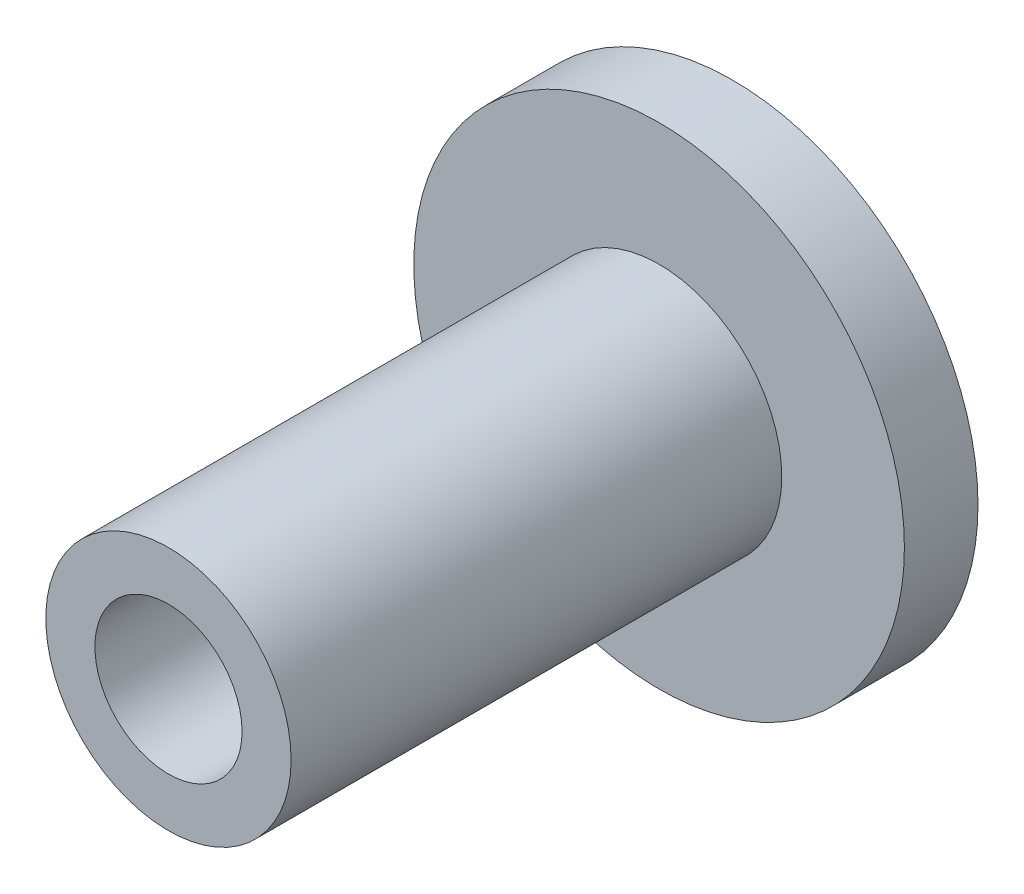
ISO-10303-21;
HEADER;
FILE_DESCRIPTION(('STEP AP214'),'2;1');
FILE_NAME('part.step','',(''),(''),'','','');
FILE_SCHEMA(('AUTOMOTIVE_DESIGN { 1 0 10303 214 1 1 1 1 }'));
ENDSEC;
DATA;
#1=APPLICATION_CONTEXT('core data for automotive mechanical design processes');
#2=APPLICATION_PROTOCOL_DEFINITION('international standard','automotive_design',2000,#1);
#3=PRODUCT_CONTEXT('',#1,'mechanical');
#4=PRODUCT('Part','Part','',(#3));
#5=PRODUCT_RELATED_PRODUCT_CATEGORY('part','',(#4));
#6=PRODUCT_DEFINITION_FORMATION('','',#4);
#7=PRODUCT_DEFINITION_CONTEXT('part definition',#1,'design');
#8=PRODUCT_DEFINITION('design','',#6,#7);
#9=PRODUCT_DEFINITION_SHAPE('','',#8);
#10=(LENGTH_UNIT() NAMED_UNIT(*) SI_UNIT(.MILLI.,.METRE.));
#11=(NAMED_UNIT(*) PLANE_ANGLE_UNIT() SI_UNIT($,.RADIAN.));
#12=(NAMED_UNIT(*) SI_UNIT($,.STERADIAN.) SOLID_ANGLE_UNIT());
#13=UNCERTAINTY_MEASURE_WITH_UNIT(LENGTH_MEASURE(1.E-05),#10,'distance_accuracy_value','');
#14=(GEOMETRIC_REPRESENTATION_CONTEXT(3) GLOBAL_UNCERTAINTY_ASSIGNED_CONTEXT((#13)) GLOBAL_UNIT_ASSIGNED_CONTEXT((#10,
#11,#12)) REPRESENTATION_CONTEXT('',''));
#15=CARTESIAN_POINT('',(0.,0.,0.));
#16=DIRECTION('',(0.,0.,1.));
#17=DIRECTION('',(1.,0.,0.));
#18=AXIS2_PLACEMENT_3D('',#15,#16,#17);
#19=CARTESIAN_POINT('',(0.,0.,3.));
#20=DIRECTION('',(0.,0.,-1.));
#21=DIRECTION('',(-1.,0.,0.));
#22=AXIS2_PLACEMENT_3D('',#19,#20,#21);
#23=CYLINDRICAL_SURFACE('',#22,10.);
#24=CARTESIAN_POINT('',(0.,0.,3.));
#25=DIRECTION('',(0.,0.,1.));
#26=DIRECTION('',(1.,0.,0.));
#27=AXIS2_PLACEMENT_3D('',#24,#25,#26);
#28=CIRCLE('',#27,10.);
#29=CARTESIAN_POINT('',(10.,0.,3.));
#30=VERTEX_POINT('',#29);
#31=EDGE_CURVE('E45',#30,#30,#28,.T.);
#32=ORIENTED_EDGE('',*,*,#31,.F.);
#33=EDGE_LOOP('',(#32));
#34=FACE_BOUND('',#33,.T.);
#35=CARTESIAN_POINT('',(0.,0.,0.));
#36=DIRECTION('',(0.,0.,1.));
#37=DIRECTION('',(1.,0.,0.));
#38=AXIS2_PLACEMENT_3D('',#35,#36,#37);
#39=CIRCLE('',#38,10.);
#40=CARTESIAN_POINT('',(10.,0.,0.));
#41=VERTEX_POINT('',#40);
#42=EDGE_CURVE('E40',#41,#41,#39,.T.);
#43=ORIENTED_EDGE('',*,*,#42,.T.);
#44=EDGE_LOOP('',(#43));
#45=FACE_BOUND('',#44,.T.);
#46=ADVANCED_FACE('F37',(#34,#45),#23,.T.);
#47=CARTESIAN_POINT('',(0.,0.,3.));
#48=DIRECTION('',(0.,0.,1.));
#49=DIRECTION('',(1.,0.,0.));
#50=AXIS2_PLACEMENT_3D('',#47,#48,#49);
#51=PLANE('',#50);
#52=CARTESIAN_POINT('',(0.,0.,3.));
#53=DIRECTION('',(0.,0.,1.));
#54=DIRECTION('',(1.,0.,0.));
#55=AXIS2_PLACEMENT_3D('',#52,#53,#54);
#56=CIRCLE('',#55,5.);
#57=CARTESIAN_POINT('',(5.,0.,3.));
#58=VERTEX_POINT('',#57);
#59=EDGE_CURVE('E10',#58,#58,#56,.T.);
#60=ORIENTED_EDGE('',*,*,#59,.F.);
#61=EDGE_LOOP('',(#60));
#62=FACE_BOUND('',#61,.T.);
#63=ORIENTED_EDGE('',*,*,#31,.T.);
#64=EDGE_LOOP('',(#63));
#65=FACE_BOUND('',#64,.T.);
#66=ADVANCED_FACE('F86',(#62,#65),#51,.T.);
#67=CARTESIAN_POINT('',(0.,0.,0.));
#68=DIRECTION('',(0.,0.,1.));
#69=DIRECTION('',(1.,0.,0.));
#70=AXIS2_PLACEMENT_3D('',#67,#68,#69);
#71=PLANE('',#70);
#72=CARTESIAN_POINT('',(0.,0.,0.));
#73=DIRECTION('',(0.,0.,1.));
#74=DIRECTION('',(1.,0.,0.));
#75=AXIS2_PLACEMENT_3D('',#72,#73,#74);
#76=CIRCLE('',#75,3.);
#77=CARTESIAN_POINT('',(3.,0.,0.));
#78=VERTEX_POINT('',#77);
#79=EDGE_CURVE('E56',#78,#78,#76,.T.);
#80=ORIENTED_EDGE('',*,*,#79,.T.);
#81=EDGE_LOOP('',(#80));
#82=FACE_BOUND('',#81,.T.);
#83=ORIENTED_EDGE('',*,*,#42,.F.);
#84=EDGE_LOOP('',(#83));
#85=FACE_BOUND('',#84,.T.);
#86=ADVANCED_FACE('F65',(#82,#85),#71,.F.);
#87=CARTESIAN_POINT('',(0.,0.,23.));
#88=DIRECTION('',(0.,0.,-1.));
#89=DIRECTION('',(-1.,0.,0.));
#90=AXIS2_PLACEMENT_3D('',#87,#88,#89);
#91=CYLINDRICAL_SURFACE('',#90,5.);
#92=CARTESIAN_POINT('',(0.,0.,23.));
#93=DIRECTION('',(0.,0.,1.));
#94=DIRECTION('',(1.,0.,0.));
#95=AXIS2_PLACEMENT_3D('',#92,#93,#94);
#96=CIRCLE('',#95,5.);
#97=CARTESIAN_POINT('',(5.,0.,23.));
#98=VERTEX_POINT('',#97);
#99=EDGE_CURVE('E52',#98,#98,#96,.T.);
#100=ORIENTED_EDGE('',*,*,#99,.F.);
#101=EDGE_LOOP('',(#100));
#102=FACE_BOUND('',#101,.T.);
#103=ORIENTED_EDGE('',*,*,#59,.T.);
#104=EDGE_LOOP('',(#103));
#105=FACE_BOUND('',#104,.T.);
#106=ADVANCED_FACE('F77',(#102,#105),#91,.T.);
#107=CARTESIAN_POINT('',(0.,0.,23.));
#108=DIRECTION('',(0.,0.,1.));
#109=DIRECTION('',(1.,0.,0.));
#110=AXIS2_PLACEMENT_3D('',#107,#108,#109);
#111=PLANE('',#110);
#112=CARTESIAN_POINT('',(0.,0.,23.));
#113=DIRECTION('',(0.,0.,1.));
#114=DIRECTION('',(1.,0.,0.));
#115=AXIS2_PLACEMENT_3D('',#112,#113,#114);
#116=CIRCLE('',#115,3.);
#117=CARTESIAN_POINT('',(3.,0.,23.));
#118=VERTEX_POINT('',#117);
#119=EDGE_CURVE('E57',#118,#118,#116,.T.);
#120=ORIENTED_EDGE('',*,*,#119,.F.);
#121=EDGE_LOOP('',(#120));
#122=FACE_BOUND('',#121,.T.);
#123=ORIENTED_EDGE('',*,*,#99,.T.);
#124=EDGE_LOOP('',(#123));
#125=FACE_BOUND('',#124,.T.);
#126=ADVANCED_FACE('F71',(#122,#125),#111,.T.);
#127=CARTESIAN_POINT('',(0.,0.,0.));
#128=DIRECTION('',(0.,0.,1.));
#129=DIRECTION('',(1.,0.,0.));
#130=AXIS2_PLACEMENT_3D('',#127,#128,#129);
#131=CYLINDRICAL_SURFACE('',#130,3.);
#132=ORIENTED_EDGE('',*,*,#79,.F.);
#133=EDGE_LOOP('',(#132));
#134=FACE_BOUND('',#133,.T.);
#135=ORIENTED_EDGE('',*,*,#119,.T.);
#136=EDGE_LOOP('',(#135));
#137=FACE_BOUND('',#136,.T.);
#138=ADVANCED_FACE('F68',(#134,#137),#131,.F.);
#139=CLOSED_SHELL('',(#46,#66,#86,#106,#126,#138));
#140=MANIFOLD_SOLID_BREP('B2',#139);
#141=ADVANCED_BREP_SHAPE_REPRESENTATION('',(#18,#140),#14);
#142=SHAPE_DEFINITION_REPRESENTATION(#9,#141);
ENDSEC;
END-ISO-10303-21;
